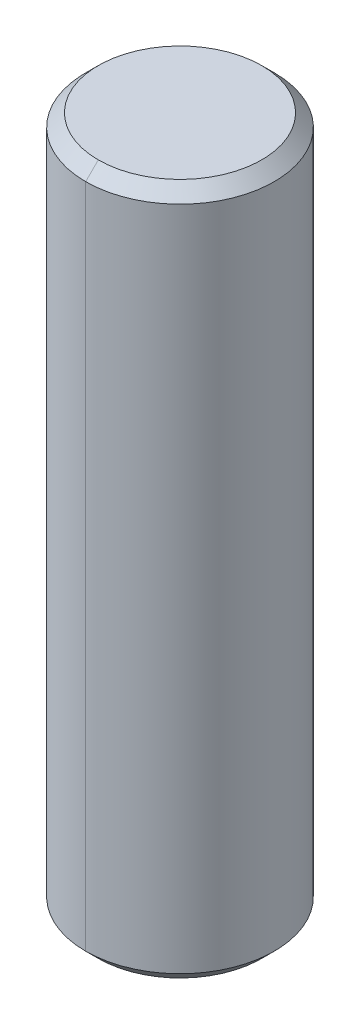
ISO-10303-21;
HEADER;
FILE_DESCRIPTION(('STEP AP214'),'2;1');
FILE_NAME('part.step','',(''),(''),'','','');
FILE_SCHEMA(('AUTOMOTIVE_DESIGN { 1 0 10303 214 1 1 1 1 }'));
ENDSEC;
DATA;
#1=APPLICATION_CONTEXT('core data for automotive mechanical design processes');
#2=APPLICATION_PROTOCOL_DEFINITION('international standard','automotive_design',2000,#1);
#3=PRODUCT_CONTEXT('',#1,'mechanical');
#4=PRODUCT('Part','Part','',(#3));
#5=PRODUCT_RELATED_PRODUCT_CATEGORY('part','',(#4));
#6=PRODUCT_DEFINITION_FORMATION('','',#4);
#7=PRODUCT_DEFINITION_CONTEXT('part definition',#1,'design');
#8=PRODUCT_DEFINITION('design','',#6,#7);
#9=PRODUCT_DEFINITION_SHAPE('','',#8);
#10=(LENGTH_UNIT() NAMED_UNIT(*) SI_UNIT(.MILLI.,.METRE.));
#11=(NAMED_UNIT(*) PLANE_ANGLE_UNIT() SI_UNIT($,.RADIAN.));
#12=(NAMED_UNIT(*) SI_UNIT($,.STERADIAN.) SOLID_ANGLE_UNIT());
#13=UNCERTAINTY_MEASURE_WITH_UNIT(LENGTH_MEASURE(1.E-05),#10,'distance_accuracy_value','');
#14=(GEOMETRIC_REPRESENTATION_CONTEXT(3) GLOBAL_UNCERTAINTY_ASSIGNED_CONTEXT((#13)) GLOBAL_UNIT_ASSIGNED_CONTEXT((#10,
#11,#12)) REPRESENTATION_CONTEXT('',''));
#15=CARTESIAN_POINT('',(0.,0.,0.));
#16=DIRECTION('',(0.,0.,1.));
#17=DIRECTION('',(1.,0.,0.));
#18=AXIS2_PLACEMENT_3D('',#15,#16,#17);
#19=CARTESIAN_POINT('',(0.,22.,0.));
#20=DIRECTION('',(0.,-1.,0.));
#21=DIRECTION('',(0.,0.,-1.));
#22=AXIS2_PLACEMENT_3D('',#19,#20,#21);
#23=CONICAL_SURFACE('',#22,2.6,0.78539816339745);
#24=DIRECTION('',(0.,-0.707106781186546,0.707106781186549));
#25=VECTOR('',#24,1.);
#26=CARTESIAN_POINT('',(0.,22.,2.6));
#27=LINE('',#26,#25);
#28=CARTESIAN_POINT('',(0.,22.,2.6));
#29=VERTEX_POINT('',#28);
#30=CARTESIAN_POINT('',(0.,21.6,3.));
#31=VERTEX_POINT('',#30);
#32=EDGE_CURVE('E91',#29,#31,#27,.T.);
#33=ORIENTED_EDGE('',*,*,#32,.F.);
#34=CARTESIAN_POINT('',(0.,22.,0.));
#35=DIRECTION('',(0.,1.,0.));
#36=DIRECTION('',(0.,0.,1.));
#37=AXIS2_PLACEMENT_3D('',#34,#35,#36);
#38=CIRCLE('',#37,2.6);
#39=CARTESIAN_POINT('',(0.,22.,-2.6));
#40=VERTEX_POINT('',#39);
#41=EDGE_CURVE('E20',#40,#29,#38,.T.);
#42=ORIENTED_EDGE('',*,*,#41,.F.);
#43=DIRECTION('',(0.,-0.707106781186546,-0.707106781186549));
#44=VECTOR('',#43,1.);
#45=CARTESIAN_POINT('',(0.,22.,-2.6));
#46=LINE('',#45,#44);
#47=CARTESIAN_POINT('',(0.,21.6,-3.));
#48=VERTEX_POINT('',#47);
#49=EDGE_CURVE('E79',#40,#48,#46,.T.);
#50=ORIENTED_EDGE('',*,*,#49,.T.);
#51=CARTESIAN_POINT('',(0.,21.6,0.));
#52=DIRECTION('',(0.,-1.,0.));
#53=DIRECTION('',(0.,0.,1.));
#54=AXIS2_PLACEMENT_3D('',#51,#52,#53);
#55=CIRCLE('',#54,3.);
#56=EDGE_CURVE('E110',#31,#48,#55,.T.);
#57=ORIENTED_EDGE('',*,*,#56,.F.);
#58=EDGE_LOOP('',(#33,#42,#50,#57));
#59=FACE_BOUND('',#58,.T.);
#60=ADVANCED_FACE('F17',(#59),#23,.T.);
#61=CARTESIAN_POINT('',(0.,0.400000000000005,0.));
#62=DIRECTION('',(0.,1.,0.));
#63=DIRECTION('',(0.,0.,1.));
#64=AXIS2_PLACEMENT_3D('',#61,#62,#63);
#65=CONICAL_SURFACE('',#64,3.,0.785398163397452);
#66=DIRECTION('',(0.,0.707106781186545,-0.70710678118655));
#67=VECTOR('',#66,1.);
#68=CARTESIAN_POINT('',(0.,0.400000000000005,-3.));
#69=LINE('',#68,#67);
#70=CARTESIAN_POINT('',(0.,0.,-2.6));
#71=VERTEX_POINT('',#70);
#72=CARTESIAN_POINT('',(0.,0.400000000000005,-3.));
#73=VERTEX_POINT('',#72);
#74=EDGE_CURVE('E67',#71,#73,#69,.T.);
#75=ORIENTED_EDGE('',*,*,#74,.F.);
#76=CARTESIAN_POINT('',(0.,0.,0.));
#77=DIRECTION('',(0.,-1.,0.));
#78=DIRECTION('',(0.,0.,1.));
#79=AXIS2_PLACEMENT_3D('',#76,#77,#78);
#80=CIRCLE('',#79,2.6);
#81=CARTESIAN_POINT('',(0.,0.,2.6));
#82=VERTEX_POINT('',#81);
#83=EDGE_CURVE('E11',#82,#71,#80,.T.);
#84=ORIENTED_EDGE('',*,*,#83,.F.);
#85=DIRECTION('',(0.,0.707106781186545,0.70710678118655));
#86=VECTOR('',#85,1.);
#87=CARTESIAN_POINT('',(0.,0.400000000000005,3.));
#88=LINE('',#87,#86);
#89=CARTESIAN_POINT('',(0.,0.400000000000005,3.));
#90=VERTEX_POINT('',#89);
#91=EDGE_CURVE('E77',#82,#90,#88,.T.);
#92=ORIENTED_EDGE('',*,*,#91,.T.);
#93=CARTESIAN_POINT('',(0.,0.400000000000005,0.));
#94=DIRECTION('',(0.,1.,0.));
#95=DIRECTION('',(0.,0.,1.));
#96=AXIS2_PLACEMENT_3D('',#93,#94,#95);
#97=CIRCLE('',#96,3.);
#98=EDGE_CURVE('E39',#73,#90,#97,.T.);
#99=ORIENTED_EDGE('',*,*,#98,.F.);
#100=EDGE_LOOP('',(#75,#84,#92,#99));
#101=FACE_BOUND('',#100,.T.);
#102=ADVANCED_FACE('F75',(#101),#65,.T.);
#103=CARTESIAN_POINT('',(0.,0.,0.));
#104=DIRECTION('',(0.,1.,0.));
#105=DIRECTION('',(1.,0.,0.));
#106=AXIS2_PLACEMENT_3D('',#103,#104,#105);
#107=PLANE('',#106);
#108=ORIENTED_EDGE('',*,*,#83,.T.);
#109=CARTESIAN_POINT('',(0.,0.,0.));
#110=DIRECTION('',(0.,-1.,0.));
#111=DIRECTION('',(0.,0.,1.));
#112=AXIS2_PLACEMENT_3D('',#109,#110,#111);
#113=CIRCLE('',#112,2.6);
#114=EDGE_CURVE('E66',#71,#82,#113,.T.);
#115=ORIENTED_EDGE('',*,*,#114,.T.);
#116=EDGE_LOOP('',(#108,#115));
#117=FACE_BOUND('',#116,.T.);
#118=ADVANCED_FACE('F65',(#117),#107,.F.);
#119=CARTESIAN_POINT('',(0.,22.,0.));
#120=DIRECTION('',(0.,1.,0.));
#121=DIRECTION('',(1.,0.,0.));
#122=AXIS2_PLACEMENT_3D('',#119,#120,#121);
#123=PLANE('',#122);
#124=ORIENTED_EDGE('',*,*,#41,.T.);
#125=CARTESIAN_POINT('',(0.,22.,0.));
#126=DIRECTION('',(0.,1.,0.));
#127=DIRECTION('',(0.,0.,1.));
#128=AXIS2_PLACEMENT_3D('',#125,#126,#127);
#129=CIRCLE('',#128,2.6);
#130=EDGE_CURVE('E95',#29,#40,#129,.T.);
#131=ORIENTED_EDGE('',*,*,#130,.T.);
#132=EDGE_LOOP('',(#124,#131));
#133=FACE_BOUND('',#132,.T.);
#134=ADVANCED_FACE('F143',(#133),#123,.T.);
#135=CARTESIAN_POINT('',(0.,22.,0.));
#136=DIRECTION('',(0.,-1.,0.));
#137=DIRECTION('',(0.,0.,-1.));
#138=AXIS2_PLACEMENT_3D('',#135,#136,#137);
#139=CYLINDRICAL_SURFACE('',#138,3.);
#140=DIRECTION('',(0.,-1.,0.));
#141=VECTOR('',#140,1.);
#142=CARTESIAN_POINT('',(0.,22.,3.));
#143=LINE('',#142,#141);
#144=EDGE_CURVE('E102',#31,#90,#143,.T.);
#145=ORIENTED_EDGE('',*,*,#144,.F.);
#146=ORIENTED_EDGE('',*,*,#56,.T.);
#147=DIRECTION('',(0.,-1.,0.));
#148=VECTOR('',#147,1.);
#149=CARTESIAN_POINT('',(0.,22.,-3.));
#150=LINE('',#149,#148);
#151=EDGE_CURVE('E109',#48,#73,#150,.T.);
#152=ORIENTED_EDGE('',*,*,#151,.T.);
#153=ORIENTED_EDGE('',*,*,#98,.T.);
#154=EDGE_LOOP('',(#145,#146,#152,#153));
#155=FACE_BOUND('',#154,.T.);
#156=ADVANCED_FACE('F117',(#155),#139,.T.);
#157=CARTESIAN_POINT('',(0.,22.,0.));
#158=DIRECTION('',(0.,-1.,0.));
#159=DIRECTION('',(0.,0.,-1.));
#160=AXIS2_PLACEMENT_3D('',#157,#158,#159);
#161=CYLINDRICAL_SURFACE('',#160,3.);
#162=CARTESIAN_POINT('',(0.,21.6,0.));
#163=DIRECTION('',(0.,-1.,0.));
#164=DIRECTION('',(0.,0.,1.));
#165=AXIS2_PLACEMENT_3D('',#162,#163,#164);
#166=CIRCLE('',#165,3.);
#167=EDGE_CURVE('E86',#48,#31,#166,.T.);
#168=ORIENTED_EDGE('',*,*,#167,.T.);
#169=ORIENTED_EDGE('',*,*,#144,.T.);
#170=CARTESIAN_POINT('',(0.,0.400000000000005,0.));
#171=DIRECTION('',(0.,1.,0.));
#172=DIRECTION('',(0.,0.,1.));
#173=AXIS2_PLACEMENT_3D('',#170,#171,#172);
#174=CIRCLE('',#173,3.);
#175=EDGE_CURVE('E74',#90,#73,#174,.T.);
#176=ORIENTED_EDGE('',*,*,#175,.T.);
#177=ORIENTED_EDGE('',*,*,#151,.F.);
#178=EDGE_LOOP('',(#168,#169,#176,#177));
#179=FACE_BOUND('',#178,.T.);
#180=ADVANCED_FACE('F120',(#179),#161,.T.);
#181=CARTESIAN_POINT('',(0.,0.400000000000005,0.));
#182=DIRECTION('',(0.,1.,0.));
#183=DIRECTION('',(0.,0.,1.));
#184=AXIS2_PLACEMENT_3D('',#181,#182,#183);
#185=CONICAL_SURFACE('',#184,3.,0.785398163397452);
#186=ORIENTED_EDGE('',*,*,#114,.F.);
#187=ORIENTED_EDGE('',*,*,#74,.T.);
#188=ORIENTED_EDGE('',*,*,#175,.F.);
#189=ORIENTED_EDGE('',*,*,#91,.F.);
#190=EDGE_LOOP('',(#186,#187,#188,#189));
#191=FACE_BOUND('',#190,.T.);
#192=ADVANCED_FACE('F80',(#191),#185,.T.);
#193=CARTESIAN_POINT('',(0.,22.,0.));
#194=DIRECTION('',(0.,-1.,0.));
#195=DIRECTION('',(0.,0.,-1.));
#196=AXIS2_PLACEMENT_3D('',#193,#194,#195);
#197=CONICAL_SURFACE('',#196,2.6,0.78539816339745);
#198=ORIENTED_EDGE('',*,*,#130,.F.);
#199=ORIENTED_EDGE('',*,*,#32,.T.);
#200=ORIENTED_EDGE('',*,*,#167,.F.);
#201=ORIENTED_EDGE('',*,*,#49,.F.);
#202=EDGE_LOOP('',(#198,#199,#200,#201));
#203=FACE_BOUND('',#202,.T.);
#204=ADVANCED_FACE('F145',(#203),#197,.T.);
#205=CLOSED_SHELL('',(#60,#102,#118,#134,#156,#180,#192,#204));
#206=MANIFOLD_SOLID_BREP('B1',#205);
#207=ADVANCED_BREP_SHAPE_REPRESENTATION('',(#18,#206),#14);
#208=SHAPE_DEFINITION_REPRESENTATION(#9,#207);
ENDSEC;
END-ISO-10303-21;
